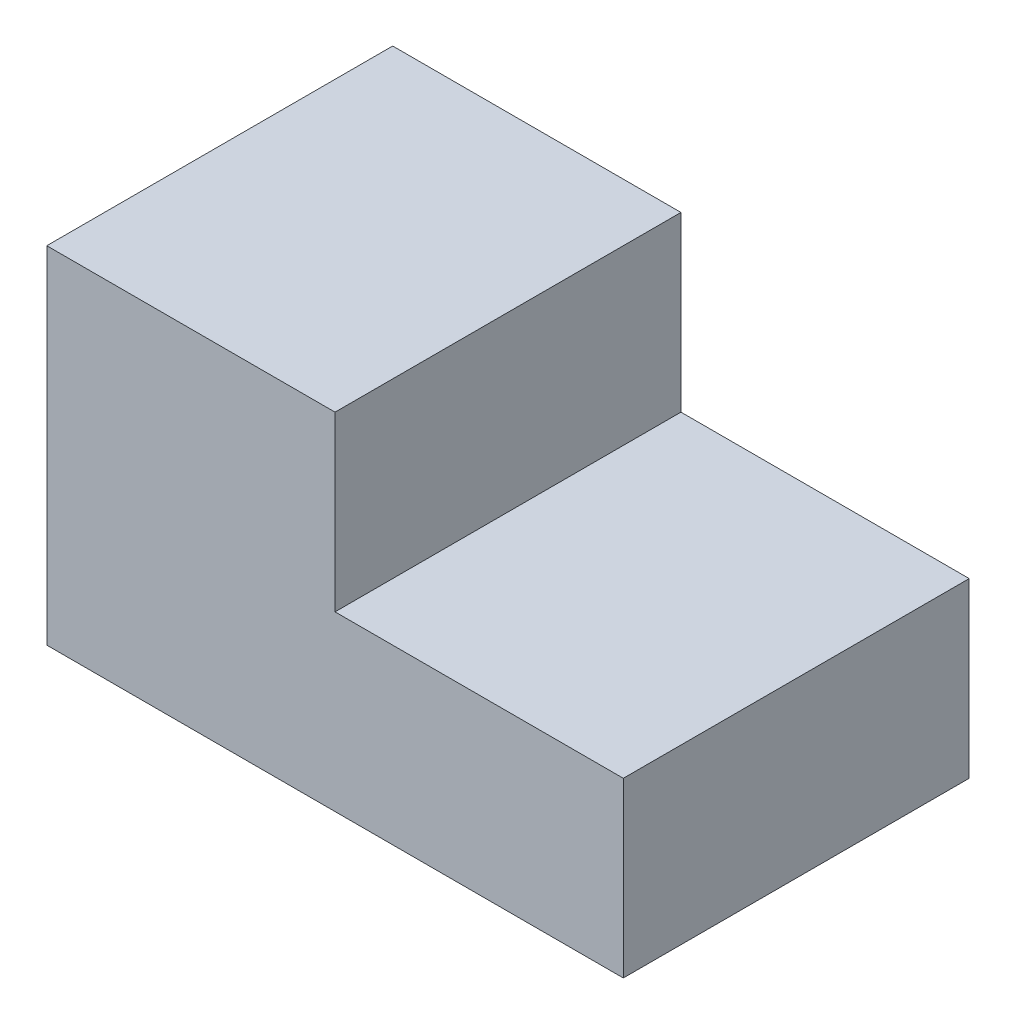
ISO-10303-21;
HEADER;
FILE_DESCRIPTION(('STEP AP214'),'2;1');
FILE_NAME('part.step','',(''),(''),'','','');
FILE_SCHEMA(('AUTOMOTIVE_DESIGN { 1 0 10303 214 1 1 1 1 }'));
ENDSEC;
DATA;
#1=APPLICATION_CONTEXT('core data for automotive mechanical design processes');
#2=APPLICATION_PROTOCOL_DEFINITION('international standard','automotive_design',2000,#1);
#3=PRODUCT_CONTEXT('',#1,'mechanical');
#4=PRODUCT('Part','Part','',(#3));
#5=PRODUCT_RELATED_PRODUCT_CATEGORY('part','',(#4));
#6=PRODUCT_DEFINITION_FORMATION('','',#4);
#7=PRODUCT_DEFINITION_CONTEXT('part definition',#1,'design');
#8=PRODUCT_DEFINITION('design','',#6,#7);
#9=PRODUCT_DEFINITION_SHAPE('','',#8);
#10=(LENGTH_UNIT() NAMED_UNIT(*) SI_UNIT(.MILLI.,.METRE.));
#11=(NAMED_UNIT(*) PLANE_ANGLE_UNIT() SI_UNIT($,.RADIAN.));
#12=(NAMED_UNIT(*) SI_UNIT($,.STERADIAN.) SOLID_ANGLE_UNIT());
#13=UNCERTAINTY_MEASURE_WITH_UNIT(LENGTH_MEASURE(1.E-05),#10,'distance_accuracy_value','');
#14=(GEOMETRIC_REPRESENTATION_CONTEXT(3) GLOBAL_UNCERTAINTY_ASSIGNED_CONTEXT((#13)) GLOBAL_UNIT_ASSIGNED_CONTEXT((#10,
#11,#12)) REPRESENTATION_CONTEXT('',''));
#15=CARTESIAN_POINT('',(0.,0.,0.));
#16=DIRECTION('',(0.,0.,1.));
#17=DIRECTION('',(1.,0.,0.));
#18=AXIS2_PLACEMENT_3D('',#15,#16,#17);
#19=CARTESIAN_POINT('',(0.,30.,60.));
#20=DIRECTION('',(1.,0.,0.));
#21=DIRECTION('',(0.,0.,-1.));
#22=AXIS2_PLACEMENT_3D('',#19,#20,#21);
#23=PLANE('',#22);
#24=DIRECTION('',(0.,-1.,0.));
#25=VECTOR('',#24,1.);
#26=CARTESIAN_POINT('',(0.,30.,0.));
#27=LINE('',#26,#25);
#28=CARTESIAN_POINT('',(0.,30.,0.));
#29=VERTEX_POINT('',#28);
#30=CARTESIAN_POINT('',(0.,0.,0.));
#31=VERTEX_POINT('',#30);
#32=EDGE_CURVE('E136',#29,#31,#27,.T.);
#33=ORIENTED_EDGE('',*,*,#32,.F.);
#34=DIRECTION('',(0.,0.,-1.));
#35=VECTOR('',#34,1.);
#36=CARTESIAN_POINT('',(0.,30.,60.));
#37=LINE('',#36,#35);
#38=CARTESIAN_POINT('',(0.,30.,60.));
#39=VERTEX_POINT('',#38);
#40=EDGE_CURVE('E11',#39,#29,#37,.T.);
#41=ORIENTED_EDGE('',*,*,#40,.F.);
#42=DIRECTION('',(0.,-1.,0.));
#43=VECTOR('',#42,1.);
#44=CARTESIAN_POINT('',(0.,30.,60.));
#45=LINE('',#44,#43);
#46=CARTESIAN_POINT('',(0.,0.,60.));
#47=VERTEX_POINT('',#46);
#48=EDGE_CURVE('E156',#39,#47,#45,.T.);
#49=ORIENTED_EDGE('',*,*,#48,.T.);
#50=DIRECTION('',(0.,0.,-1.));
#51=VECTOR('',#50,1.);
#52=CARTESIAN_POINT('',(0.,0.,60.));
#53=LINE('',#52,#51);
#54=EDGE_CURVE('E48',#47,#31,#53,.T.);
#55=ORIENTED_EDGE('',*,*,#54,.T.);
#56=EDGE_LOOP('',(#33,#41,#49,#55));
#57=FACE_BOUND('',#56,.T.);
#58=ADVANCED_FACE('F45',(#57),#23,.T.);
#59=CARTESIAN_POINT('',(-50.,30.,60.));
#60=DIRECTION('',(0.,1.,0.));
#61=DIRECTION('',(0.,0.,1.));
#62=AXIS2_PLACEMENT_3D('',#59,#60,#61);
#63=PLANE('',#62);
#64=DIRECTION('',(1.,0.,0.));
#65=VECTOR('',#64,1.);
#66=CARTESIAN_POINT('',(-50.,30.,0.));
#67=LINE('',#66,#65);
#68=CARTESIAN_POINT('',(-50.,30.,0.));
#69=VERTEX_POINT('',#68);
#70=EDGE_CURVE('E153',#69,#29,#67,.T.);
#71=ORIENTED_EDGE('',*,*,#70,.F.);
#72=DIRECTION('',(0.,0.,-1.));
#73=VECTOR('',#72,1.);
#74=CARTESIAN_POINT('',(-50.,30.,60.));
#75=LINE('',#74,#73);
#76=CARTESIAN_POINT('',(-50.,30.,60.));
#77=VERTEX_POINT('',#76);
#78=EDGE_CURVE('E55',#77,#69,#75,.T.);
#79=ORIENTED_EDGE('',*,*,#78,.F.);
#80=DIRECTION('',(1.,0.,0.));
#81=VECTOR('',#80,1.);
#82=CARTESIAN_POINT('',(-50.,30.,60.));
#83=LINE('',#82,#81);
#84=EDGE_CURVE('E122',#77,#39,#83,.T.);
#85=ORIENTED_EDGE('',*,*,#84,.T.);
#86=ORIENTED_EDGE('',*,*,#40,.T.);
#87=EDGE_LOOP('',(#71,#79,#85,#86));
#88=FACE_BOUND('',#87,.T.);
#89=ADVANCED_FACE('F168',(#88),#63,.T.);
#90=CARTESIAN_POINT('',(-50.,60.,60.));
#91=DIRECTION('',(1.,0.,0.));
#92=DIRECTION('',(0.,0.,-1.));
#93=AXIS2_PLACEMENT_3D('',#90,#91,#92);
#94=PLANE('',#93);
#95=DIRECTION('',(0.,-1.,0.));
#96=VECTOR('',#95,1.);
#97=CARTESIAN_POINT('',(-50.,60.,0.));
#98=LINE('',#97,#96);
#99=CARTESIAN_POINT('',(-50.,60.,0.));
#100=VERTEX_POINT('',#99);
#101=EDGE_CURVE('E108',#100,#69,#98,.T.);
#102=ORIENTED_EDGE('',*,*,#101,.F.);
#103=DIRECTION('',(0.,0.,-1.));
#104=VECTOR('',#103,1.);
#105=CARTESIAN_POINT('',(-50.,60.,60.));
#106=LINE('',#105,#104);
#107=CARTESIAN_POINT('',(-50.,60.,60.));
#108=VERTEX_POINT('',#107);
#109=EDGE_CURVE('E103',#108,#100,#106,.T.);
#110=ORIENTED_EDGE('',*,*,#109,.F.);
#111=DIRECTION('',(0.,-1.,0.));
#112=VECTOR('',#111,1.);
#113=CARTESIAN_POINT('',(-50.,60.,60.));
#114=LINE('',#113,#112);
#115=EDGE_CURVE('E106',#108,#77,#114,.T.);
#116=ORIENTED_EDGE('',*,*,#115,.T.);
#117=ORIENTED_EDGE('',*,*,#78,.T.);
#118=EDGE_LOOP('',(#102,#110,#116,#117));
#119=FACE_BOUND('',#118,.T.);
#120=ADVANCED_FACE('F105',(#119),#94,.T.);
#121=CARTESIAN_POINT('',(-100.,60.,60.));
#122=DIRECTION('',(0.,1.,0.));
#123=DIRECTION('',(0.,0.,1.));
#124=AXIS2_PLACEMENT_3D('',#121,#122,#123);
#125=PLANE('',#124);
#126=DIRECTION('',(1.,0.,0.));
#127=VECTOR('',#126,1.);
#128=CARTESIAN_POINT('',(-100.,60.,0.));
#129=LINE('',#128,#127);
#130=CARTESIAN_POINT('',(-100.,60.,0.));
#131=VERTEX_POINT('',#130);
#132=EDGE_CURVE('E148',#131,#100,#129,.T.);
#133=ORIENTED_EDGE('',*,*,#132,.F.);
#134=DIRECTION('',(0.,0.,-1.));
#135=VECTOR('',#134,1.);
#136=CARTESIAN_POINT('',(-100.,60.,60.));
#137=LINE('',#136,#135);
#138=CARTESIAN_POINT('',(-100.,60.,60.));
#139=VERTEX_POINT('',#138);
#140=EDGE_CURVE('E114',#139,#131,#137,.T.);
#141=ORIENTED_EDGE('',*,*,#140,.F.);
#142=DIRECTION('',(1.,0.,0.));
#143=VECTOR('',#142,1.);
#144=CARTESIAN_POINT('',(-100.,60.,60.));
#145=LINE('',#144,#143);
#146=EDGE_CURVE('E120',#139,#108,#145,.T.);
#147=ORIENTED_EDGE('',*,*,#146,.T.);
#148=ORIENTED_EDGE('',*,*,#109,.T.);
#149=EDGE_LOOP('',(#133,#141,#147,#148));
#150=FACE_BOUND('',#149,.T.);
#151=ADVANCED_FACE('F125',(#150),#125,.T.);
#152=CARTESIAN_POINT('',(-100.,0.,60.));
#153=DIRECTION('',(-1.,0.,0.));
#154=DIRECTION('',(0.,0.,1.));
#155=AXIS2_PLACEMENT_3D('',#152,#153,#154);
#156=PLANE('',#155);
#157=DIRECTION('',(0.,1.,0.));
#158=VECTOR('',#157,1.);
#159=CARTESIAN_POINT('',(-100.,0.,0.));
#160=LINE('',#159,#158);
#161=CARTESIAN_POINT('',(-100.,0.,0.));
#162=VERTEX_POINT('',#161);
#163=EDGE_CURVE('E144',#162,#131,#160,.T.);
#164=ORIENTED_EDGE('',*,*,#163,.F.);
#165=DIRECTION('',(0.,0.,-1.));
#166=VECTOR('',#165,1.);
#167=CARTESIAN_POINT('',(-100.,0.,60.));
#168=LINE('',#167,#166);
#169=CARTESIAN_POINT('',(-100.,0.,60.));
#170=VERTEX_POINT('',#169);
#171=EDGE_CURVE('E161',#170,#162,#168,.T.);
#172=ORIENTED_EDGE('',*,*,#171,.F.);
#173=DIRECTION('',(0.,1.,0.));
#174=VECTOR('',#173,1.);
#175=CARTESIAN_POINT('',(-100.,0.,60.));
#176=LINE('',#175,#174);
#177=EDGE_CURVE('E127',#170,#139,#176,.T.);
#178=ORIENTED_EDGE('',*,*,#177,.T.);
#179=ORIENTED_EDGE('',*,*,#140,.T.);
#180=EDGE_LOOP('',(#164,#172,#178,#179));
#181=FACE_BOUND('',#180,.T.);
#182=ADVANCED_FACE('F181',(#181),#156,.T.);
#183=CARTESIAN_POINT('',(0.,0.,60.));
#184=DIRECTION('',(0.,-1.,0.));
#185=DIRECTION('',(0.,0.,-1.));
#186=AXIS2_PLACEMENT_3D('',#183,#184,#185);
#187=PLANE('',#186);
#188=DIRECTION('',(-1.,0.,0.));
#189=VECTOR('',#188,1.);
#190=CARTESIAN_POINT('',(0.,0.,0.));
#191=LINE('',#190,#189);
#192=EDGE_CURVE('E140',#31,#162,#191,.T.);
#193=ORIENTED_EDGE('',*,*,#192,.F.);
#194=ORIENTED_EDGE('',*,*,#54,.F.);
#195=DIRECTION('',(-1.,0.,0.));
#196=VECTOR('',#195,1.);
#197=CARTESIAN_POINT('',(0.,0.,60.));
#198=LINE('',#197,#196);
#199=EDGE_CURVE('E130',#47,#170,#198,.T.);
#200=ORIENTED_EDGE('',*,*,#199,.T.);
#201=ORIENTED_EDGE('',*,*,#171,.T.);
#202=EDGE_LOOP('',(#193,#194,#200,#201));
#203=FACE_BOUND('',#202,.T.);
#204=ADVANCED_FACE('F165',(#203),#187,.T.);
#205=CARTESIAN_POINT('',(0.,0.,60.));
#206=DIRECTION('',(0.,0.,-1.));
#207=DIRECTION('',(-1.,0.,0.));
#208=AXIS2_PLACEMENT_3D('',#205,#206,#207);
#209=PLANE('',#208);
#210=ORIENTED_EDGE('',*,*,#48,.F.);
#211=ORIENTED_EDGE('',*,*,#84,.F.);
#212=ORIENTED_EDGE('',*,*,#115,.F.);
#213=ORIENTED_EDGE('',*,*,#146,.F.);
#214=ORIENTED_EDGE('',*,*,#177,.F.);
#215=ORIENTED_EDGE('',*,*,#199,.F.);
#216=EDGE_LOOP('',(#210,#211,#212,#213,#214,#215));
#217=FACE_BOUND('',#216,.T.);
#218=ADVANCED_FACE('F118',(#217),#209,.F.);
#219=CARTESIAN_POINT('',(0.,0.,0.));
#220=DIRECTION('',(0.,0.,-1.));
#221=DIRECTION('',(-1.,0.,0.));
#222=AXIS2_PLACEMENT_3D('',#219,#220,#221);
#223=PLANE('',#222);
#224=ORIENTED_EDGE('',*,*,#32,.T.);
#225=ORIENTED_EDGE('',*,*,#192,.T.);
#226=ORIENTED_EDGE('',*,*,#163,.T.);
#227=ORIENTED_EDGE('',*,*,#132,.T.);
#228=ORIENTED_EDGE('',*,*,#101,.T.);
#229=ORIENTED_EDGE('',*,*,#70,.T.);
#230=EDGE_LOOP('',(#224,#225,#226,#227,#228,#229));
#231=FACE_BOUND('',#230,.T.);
#232=ADVANCED_FACE('F167',(#231),#223,.T.);
#233=CLOSED_SHELL('',(#58,#89,#120,#151,#182,#204,#218,#232));
#234=MANIFOLD_SOLID_BREP('B2',#233);
#235=ADVANCED_BREP_SHAPE_REPRESENTATION('',(#18,#234),#14);
#236=SHAPE_DEFINITION_REPRESENTATION(#9,#235);
ENDSEC;
END-ISO-10303-21;
